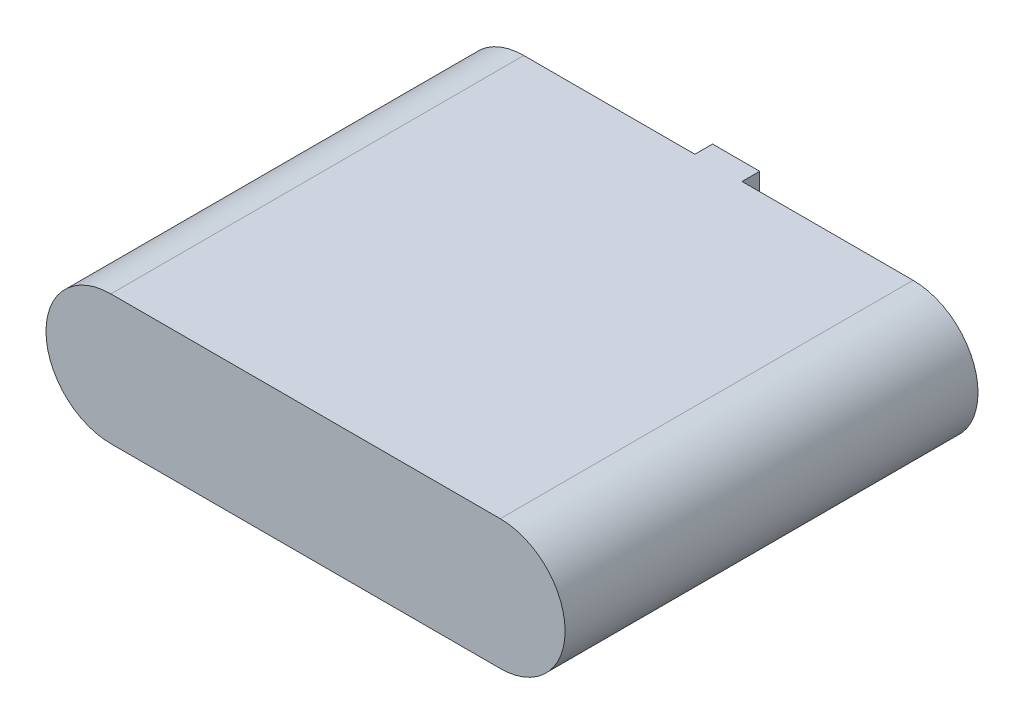
ISO-10303-21;
HEADER;
FILE_DESCRIPTION(('STEP AP214'),'2;1');
FILE_NAME('part.step','',(''),(''),'','','');
FILE_SCHEMA(('AUTOMOTIVE_DESIGN { 1 0 10303 214 1 1 1 1 }'));
ENDSEC;
DATA;
#1=APPLICATION_CONTEXT('core data for automotive mechanical design processes');
#2=APPLICATION_PROTOCOL_DEFINITION('international standard','automotive_design',2000,#1);
#3=PRODUCT_CONTEXT('',#1,'mechanical');
#4=PRODUCT('Part','Part','',(#3));
#5=PRODUCT_RELATED_PRODUCT_CATEGORY('part','',(#4));
#6=PRODUCT_DEFINITION_FORMATION('','',#4);
#7=PRODUCT_DEFINITION_CONTEXT('part definition',#1,'design');
#8=PRODUCT_DEFINITION('design','',#6,#7);
#9=PRODUCT_DEFINITION_SHAPE('','',#8);
#10=(LENGTH_UNIT() NAMED_UNIT(*) SI_UNIT(.MILLI.,.METRE.));
#11=(NAMED_UNIT(*) PLANE_ANGLE_UNIT() SI_UNIT($,.RADIAN.));
#12=(NAMED_UNIT(*) SI_UNIT($,.STERADIAN.) SOLID_ANGLE_UNIT());
#13=UNCERTAINTY_MEASURE_WITH_UNIT(LENGTH_MEASURE(1.E-05),#10,'distance_accuracy_value','');
#14=(GEOMETRIC_REPRESENTATION_CONTEXT(3) GLOBAL_UNCERTAINTY_ASSIGNED_CONTEXT((#13)) GLOBAL_UNIT_ASSIGNED_CONTEXT((#10,
#11,#12)) REPRESENTATION_CONTEXT('',''));
#15=CARTESIAN_POINT('',(0.,0.,0.));
#16=DIRECTION('',(0.,0.,1.));
#17=DIRECTION('',(1.,0.,0.));
#18=AXIS2_PLACEMENT_3D('',#15,#16,#17);
#19=CARTESIAN_POINT('',(0.,0.,70.));
#20=DIRECTION('',(0.,0.,-1.));
#21=DIRECTION('',(-1.,0.,0.));
#22=AXIS2_PLACEMENT_3D('',#19,#20,#21);
#23=CYLINDRICAL_SURFACE('',#22,11.);
#24=CARTESIAN_POINT('',(0.,0.,0.));
#25=DIRECTION('',(0.,0.,1.));
#26=DIRECTION('',(1.,0.,0.));
#27=AXIS2_PLACEMENT_3D('',#24,#25,#26);
#28=CIRCLE('',#27,11.);
#29=CARTESIAN_POINT('',(0.,11.,0.));
#30=VERTEX_POINT('',#29);
#31=CARTESIAN_POINT('',(0.,-11.,0.));
#32=VERTEX_POINT('',#31);
#33=EDGE_CURVE('E119',#30,#32,#28,.T.);
#34=ORIENTED_EDGE('',*,*,#33,.T.);
#35=DIRECTION('',(0.,0.,-1.));
#36=VECTOR('',#35,1.);
#37=CARTESIAN_POINT('',(0.,-11.,70.));
#38=LINE('',#37,#36);
#39=CARTESIAN_POINT('',(0.,-11.,70.));
#40=VERTEX_POINT('',#39);
#41=EDGE_CURVE('E11',#40,#32,#38,.T.);
#42=ORIENTED_EDGE('',*,*,#41,.F.);
#43=CARTESIAN_POINT('',(0.,0.,70.));
#44=DIRECTION('',(0.,0.,1.));
#45=DIRECTION('',(1.,0.,0.));
#46=AXIS2_PLACEMENT_3D('',#43,#44,#45);
#47=CIRCLE('',#46,11.);
#48=CARTESIAN_POINT('',(0.,11.,70.));
#49=VERTEX_POINT('',#48);
#50=EDGE_CURVE('E147',#49,#40,#47,.T.);
#51=ORIENTED_EDGE('',*,*,#50,.F.);
#52=DIRECTION('',(0.,0.,-1.));
#53=VECTOR('',#52,1.);
#54=CARTESIAN_POINT('',(0.,11.,70.));
#55=LINE('',#54,#53);
#56=EDGE_CURVE('E159',#49,#30,#55,.T.);
#57=ORIENTED_EDGE('',*,*,#56,.T.);
#58=EDGE_LOOP('',(#34,#42,#51,#57));
#59=FACE_BOUND('',#58,.T.);
#60=ADVANCED_FACE('F47',(#59),#23,.T.);
#61=CARTESIAN_POINT('',(0.,-11.,70.));
#62=DIRECTION('',(0.,1.,0.));
#63=DIRECTION('',(0.,0.,1.));
#64=AXIS2_PLACEMENT_3D('',#61,#62,#63);
#65=PLANE('',#64);
#66=DIRECTION('',(1.,0.,0.));
#67=VECTOR('',#66,1.);
#68=CARTESIAN_POINT('',(0.,-11.,0.));
#69=LINE('',#68,#67);
#70=CARTESIAN_POINT('',(66.,-11.,0.));
#71=VERTEX_POINT('',#70);
#72=EDGE_CURVE('E162',#32,#71,#69,.T.);
#73=ORIENTED_EDGE('',*,*,#72,.T.);
#74=DIRECTION('',(0.,0.,-1.));
#75=VECTOR('',#74,1.);
#76=CARTESIAN_POINT('',(66.,-11.,70.));
#77=LINE('',#76,#75);
#78=CARTESIAN_POINT('',(66.,-11.,70.));
#79=VERTEX_POINT('',#78);
#80=EDGE_CURVE('E57',#79,#71,#77,.T.);
#81=ORIENTED_EDGE('',*,*,#80,.F.);
#82=DIRECTION('',(1.,0.,0.));
#83=VECTOR('',#82,1.);
#84=CARTESIAN_POINT('',(0.,-11.,70.));
#85=LINE('',#84,#83);
#86=EDGE_CURVE('E153',#40,#79,#85,.T.);
#87=ORIENTED_EDGE('',*,*,#86,.F.);
#88=ORIENTED_EDGE('',*,*,#41,.T.);
#89=EDGE_LOOP('',(#73,#81,#87,#88));
#90=FACE_BOUND('',#89,.T.);
#91=ADVANCED_FACE('F197',(#90),#65,.F.);
#92=CARTESIAN_POINT('',(66.,0.,70.));
#93=DIRECTION('',(0.,0.,-1.));
#94=DIRECTION('',(-1.,0.,0.));
#95=AXIS2_PLACEMENT_3D('',#92,#93,#94);
#96=CYLINDRICAL_SURFACE('',#95,11.);
#97=CARTESIAN_POINT('',(66.,0.,0.));
#98=DIRECTION('',(0.,0.,1.));
#99=DIRECTION('',(1.,0.,0.));
#100=AXIS2_PLACEMENT_3D('',#97,#98,#99);
#101=CIRCLE('',#100,11.);
#102=CARTESIAN_POINT('',(66.,11.,0.));
#103=VERTEX_POINT('',#102);
#104=EDGE_CURVE('E164',#71,#103,#101,.T.);
#105=ORIENTED_EDGE('',*,*,#104,.T.);
#106=DIRECTION('',(0.,0.,-1.));
#107=VECTOR('',#106,1.);
#108=CARTESIAN_POINT('',(66.,11.,70.));
#109=LINE('',#108,#107);
#110=CARTESIAN_POINT('',(66.,11.,70.));
#111=VERTEX_POINT('',#110);
#112=EDGE_CURVE('E168',#111,#103,#109,.T.);
#113=ORIENTED_EDGE('',*,*,#112,.F.);
#114=CARTESIAN_POINT('',(66.,0.,70.));
#115=DIRECTION('',(0.,0.,1.));
#116=DIRECTION('',(1.,0.,0.));
#117=AXIS2_PLACEMENT_3D('',#114,#115,#116);
#118=CIRCLE('',#117,11.);
#119=EDGE_CURVE('E156',#79,#111,#118,.T.);
#120=ORIENTED_EDGE('',*,*,#119,.F.);
#121=ORIENTED_EDGE('',*,*,#80,.T.);
#122=EDGE_LOOP('',(#105,#113,#120,#121));
#123=FACE_BOUND('',#122,.T.);
#124=ADVANCED_FACE('F180',(#123),#96,.T.);
#125=CARTESIAN_POINT('',(0.,11.,70.));
#126=DIRECTION('',(0.,-1.,0.));
#127=DIRECTION('',(0.,0.,-1.));
#128=AXIS2_PLACEMENT_3D('',#125,#126,#127);
#129=PLANE('',#128);
#130=DIRECTION('',(-1.,0.,0.));
#131=VECTOR('',#130,1.);
#132=CARTESIAN_POINT('',(0.,11.,0.));
#133=LINE('',#132,#131);
#134=CARTESIAN_POINT('',(37.,11.,0.));
#135=VERTEX_POINT('',#134);
#136=EDGE_CURVE('E152',#103,#135,#133,.T.);
#137=ORIENTED_EDGE('',*,*,#136,.T.);
#138=DIRECTION('',(0.,0.,1.));
#139=VECTOR('',#138,1.);
#140=CARTESIAN_POINT('',(37.,11.,-3.));
#141=LINE('',#140,#139);
#142=CARTESIAN_POINT('',(37.,11.,-3.));
#143=VERTEX_POINT('',#142);
#144=EDGE_CURVE('E117',#143,#135,#141,.T.);
#145=ORIENTED_EDGE('',*,*,#144,.F.);
#146=DIRECTION('',(1.,0.,0.));
#147=VECTOR('',#146,1.);
#148=CARTESIAN_POINT('',(0.,11.,-3.));
#149=LINE('',#148,#147);
#150=CARTESIAN_POINT('',(29.,11.,-3.));
#151=VERTEX_POINT('',#150);
#152=EDGE_CURVE('E121',#151,#143,#149,.T.);
#153=ORIENTED_EDGE('',*,*,#152,.F.);
#154=DIRECTION('',(0.,0.,1.));
#155=VECTOR('',#154,1.);
#156=CARTESIAN_POINT('',(29.,11.,-3.));
#157=LINE('',#156,#155);
#158=CARTESIAN_POINT('',(29.,11.,0.));
#159=VERTEX_POINT('',#158);
#160=EDGE_CURVE('E112',#151,#159,#157,.T.);
#161=ORIENTED_EDGE('',*,*,#160,.T.);
#162=EDGE_CURVE('E68',#159,#30,#133,.T.);
#163=ORIENTED_EDGE('',*,*,#162,.T.);
#164=ORIENTED_EDGE('',*,*,#56,.F.);
#165=DIRECTION('',(-1.,0.,0.));
#166=VECTOR('',#165,1.);
#167=CARTESIAN_POINT('',(0.,11.,70.));
#168=LINE('',#167,#166);
#169=EDGE_CURVE('E158',#111,#49,#168,.T.);
#170=ORIENTED_EDGE('',*,*,#169,.F.);
#171=ORIENTED_EDGE('',*,*,#112,.T.);
#172=EDGE_LOOP('',(#137,#145,#153,#161,#163,#164,#170,#171));
#173=FACE_BOUND('',#172,.T.);
#174=ADVANCED_FACE('F123',(#173),#129,.F.);
#175=CARTESIAN_POINT('',(0.,0.,70.));
#176=DIRECTION('',(0.,0.,1.));
#177=DIRECTION('',(1.,0.,0.));
#178=AXIS2_PLACEMENT_3D('',#175,#176,#177);
#179=PLANE('',#178);
#180=ORIENTED_EDGE('',*,*,#50,.T.);
#181=ORIENTED_EDGE('',*,*,#86,.T.);
#182=ORIENTED_EDGE('',*,*,#119,.T.);
#183=ORIENTED_EDGE('',*,*,#169,.T.);
#184=EDGE_LOOP('',(#180,#181,#182,#183));
#185=FACE_BOUND('',#184,.T.);
#186=ADVANCED_FACE('F206',(#185),#179,.T.);
#187=CARTESIAN_POINT('',(0.,0.,0.));
#188=DIRECTION('',(0.,0.,1.));
#189=DIRECTION('',(1.,0.,0.));
#190=AXIS2_PLACEMENT_3D('',#187,#188,#189);
#191=PLANE('',#190);
#192=ORIENTED_EDGE('',*,*,#162,.F.);
#193=DIRECTION('',(0.,-1.,0.));
#194=VECTOR('',#193,1.);
#195=CARTESIAN_POINT('',(29.,0.,0.));
#196=LINE('',#195,#194);
#197=CARTESIAN_POINT('',(29.,7.,0.));
#198=VERTEX_POINT('',#197);
#199=EDGE_CURVE('E62',#159,#198,#196,.T.);
#200=ORIENTED_EDGE('',*,*,#199,.T.);
#201=DIRECTION('',(-1.,0.,0.));
#202=VECTOR('',#201,1.);
#203=CARTESIAN_POINT('',(0.,7.00000000000001,0.));
#204=LINE('',#203,#202);
#205=CARTESIAN_POINT('',(37.,7.,0.));
#206=VERTEX_POINT('',#205);
#207=EDGE_CURVE('E132',#206,#198,#204,.T.);
#208=ORIENTED_EDGE('',*,*,#207,.F.);
#209=DIRECTION('',(0.,-1.,0.));
#210=VECTOR('',#209,1.);
#211=CARTESIAN_POINT('',(37.,0.,0.));
#212=LINE('',#211,#210);
#213=EDGE_CURVE('E136',#135,#206,#212,.T.);
#214=ORIENTED_EDGE('',*,*,#213,.F.);
#215=ORIENTED_EDGE('',*,*,#136,.F.);
#216=ORIENTED_EDGE('',*,*,#104,.F.);
#217=ORIENTED_EDGE('',*,*,#72,.F.);
#218=ORIENTED_EDGE('',*,*,#33,.F.);
#219=EDGE_LOOP('',(#192,#200,#208,#214,#215,#216,#217,#218));
#220=FACE_BOUND('',#219,.T.);
#221=ADVANCED_FACE('F182',(#220),#191,.F.);
#222=CARTESIAN_POINT('',(29.,0.,-3.));
#223=DIRECTION('',(-1.,0.,0.));
#224=DIRECTION('',(0.,-1.,0.));
#225=AXIS2_PLACEMENT_3D('',#222,#223,#224);
#226=PLANE('',#225);
#227=ORIENTED_EDGE('',*,*,#199,.F.);
#228=ORIENTED_EDGE('',*,*,#160,.F.);
#229=DIRECTION('',(0.,-1.,0.));
#230=VECTOR('',#229,1.);
#231=CARTESIAN_POINT('',(29.,0.,-3.));
#232=LINE('',#231,#230);
#233=CARTESIAN_POINT('',(29.,7.,-3.));
#234=VERTEX_POINT('',#233);
#235=EDGE_CURVE('E113',#151,#234,#232,.T.);
#236=ORIENTED_EDGE('',*,*,#235,.T.);
#237=DIRECTION('',(0.,0.,1.));
#238=VECTOR('',#237,1.);
#239=CARTESIAN_POINT('',(29.,7.,-3.));
#240=LINE('',#239,#238);
#241=EDGE_CURVE('E143',#234,#198,#240,.T.);
#242=ORIENTED_EDGE('',*,*,#241,.T.);
#243=EDGE_LOOP('',(#227,#228,#236,#242));
#244=FACE_BOUND('',#243,.T.);
#245=ADVANCED_FACE('F114',(#244),#226,.T.);
#246=CARTESIAN_POINT('',(37.,0.,-3.));
#247=DIRECTION('',(-1.,0.,0.));
#248=DIRECTION('',(0.,-1.,0.));
#249=AXIS2_PLACEMENT_3D('',#246,#247,#248);
#250=PLANE('',#249);
#251=ORIENTED_EDGE('',*,*,#213,.T.);
#252=DIRECTION('',(0.,0.,1.));
#253=VECTOR('',#252,1.);
#254=CARTESIAN_POINT('',(37.,7.,-3.));
#255=LINE('',#254,#253);
#256=CARTESIAN_POINT('',(37.,7.,-3.));
#257=VERTEX_POINT('',#256);
#258=EDGE_CURVE('E148',#257,#206,#255,.T.);
#259=ORIENTED_EDGE('',*,*,#258,.F.);
#260=DIRECTION('',(0.,-1.,0.));
#261=VECTOR('',#260,1.);
#262=CARTESIAN_POINT('',(37.,0.,-3.));
#263=LINE('',#262,#261);
#264=EDGE_CURVE('E130',#143,#257,#263,.T.);
#265=ORIENTED_EDGE('',*,*,#264,.F.);
#266=ORIENTED_EDGE('',*,*,#144,.T.);
#267=EDGE_LOOP('',(#251,#259,#265,#266));
#268=FACE_BOUND('',#267,.T.);
#269=ADVANCED_FACE('F184',(#268),#250,.F.);
#270=CARTESIAN_POINT('',(0.,7.00000000000001,-3.));
#271=DIRECTION('',(0.,1.,0.));
#272=DIRECTION('',(-1.,0.,0.));
#273=AXIS2_PLACEMENT_3D('',#270,#271,#272);
#274=PLANE('',#273);
#275=ORIENTED_EDGE('',*,*,#207,.T.);
#276=ORIENTED_EDGE('',*,*,#241,.F.);
#277=DIRECTION('',(-1.,0.,0.));
#278=VECTOR('',#277,1.);
#279=CARTESIAN_POINT('',(0.,7.00000000000001,-3.));
#280=LINE('',#279,#278);
#281=EDGE_CURVE('E133',#257,#234,#280,.T.);
#282=ORIENTED_EDGE('',*,*,#281,.F.);
#283=ORIENTED_EDGE('',*,*,#258,.T.);
#284=EDGE_LOOP('',(#275,#276,#282,#283));
#285=FACE_BOUND('',#284,.T.);
#286=ADVANCED_FACE('F189',(#285),#274,.F.);
#287=CARTESIAN_POINT('',(0.,0.,-3.));
#288=DIRECTION('',(0.,0.,-1.));
#289=DIRECTION('',(-1.,0.,0.));
#290=AXIS2_PLACEMENT_3D('',#287,#288,#289);
#291=PLANE('',#290);
#292=ORIENTED_EDGE('',*,*,#235,.F.);
#293=ORIENTED_EDGE('',*,*,#152,.T.);
#294=ORIENTED_EDGE('',*,*,#264,.T.);
#295=ORIENTED_EDGE('',*,*,#281,.T.);
#296=EDGE_LOOP('',(#292,#293,#294,#295));
#297=FACE_BOUND('',#296,.T.);
#298=ADVANCED_FACE('F129',(#297),#291,.T.);
#299=CLOSED_SHELL('',(#60,#91,#124,#174,#186,#221,#245,#269,#286,#298));
#300=MANIFOLD_SOLID_BREP('B2',#299);
#301=ADVANCED_BREP_SHAPE_REPRESENTATION('',(#18,#300),#14);
#302=SHAPE_DEFINITION_REPRESENTATION(#9,#301);
ENDSEC;
END-ISO-10303-21;
